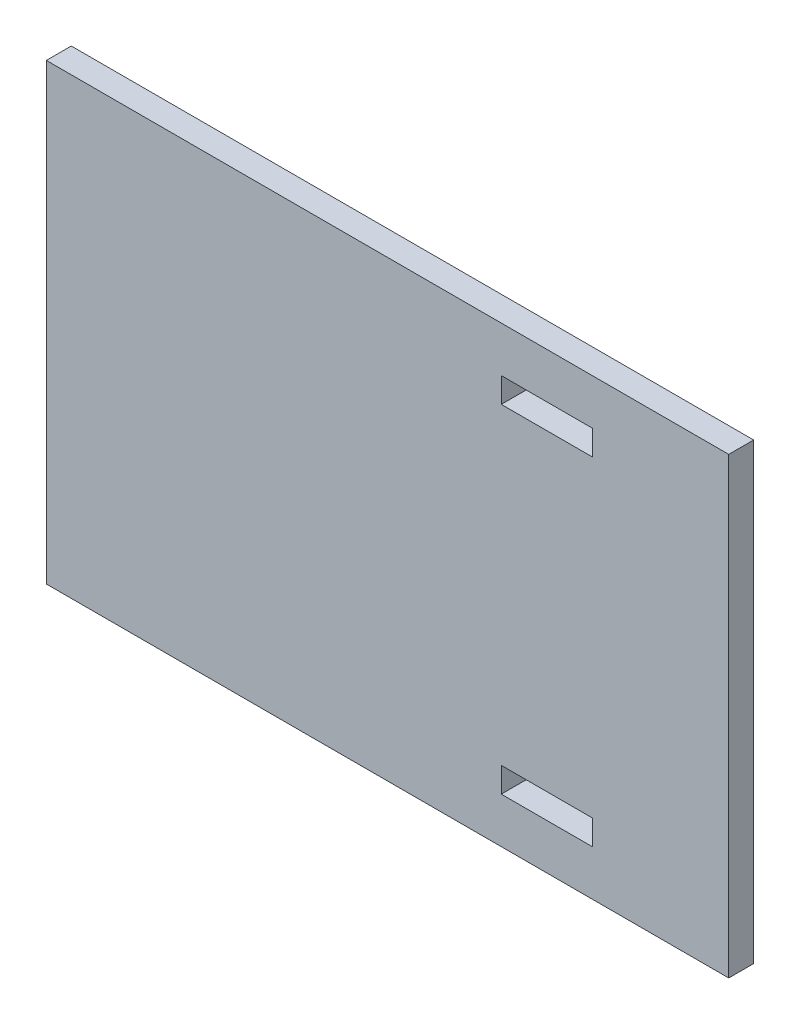
ISO-10303-21;
HEADER;
FILE_DESCRIPTION(('STEP AP214'),'2;1');
FILE_NAME('part.step','',(''),(''),'','','');
FILE_SCHEMA(('AUTOMOTIVE_DESIGN { 1 0 10303 214 1 1 1 1 }'));
ENDSEC;
DATA;
#1=APPLICATION_CONTEXT('core data for automotive mechanical design processes');
#2=APPLICATION_PROTOCOL_DEFINITION('international standard','automotive_design',2000,#1);
#3=PRODUCT_CONTEXT('',#1,'mechanical');
#4=PRODUCT('Part','Part','',(#3));
#5=PRODUCT_RELATED_PRODUCT_CATEGORY('part','',(#4));
#6=PRODUCT_DEFINITION_FORMATION('','',#4);
#7=PRODUCT_DEFINITION_CONTEXT('part definition',#1,'design');
#8=PRODUCT_DEFINITION('design','',#6,#7);
#9=PRODUCT_DEFINITION_SHAPE('','',#8);
#10=(LENGTH_UNIT() NAMED_UNIT(*) SI_UNIT(.MILLI.,.METRE.));
#11=(NAMED_UNIT(*) PLANE_ANGLE_UNIT() SI_UNIT($,.RADIAN.));
#12=(NAMED_UNIT(*) SI_UNIT($,.STERADIAN.) SOLID_ANGLE_UNIT());
#13=UNCERTAINTY_MEASURE_WITH_UNIT(LENGTH_MEASURE(1.E-05),#10,'distance_accuracy_value','');
#14=(GEOMETRIC_REPRESENTATION_CONTEXT(3) GLOBAL_UNCERTAINTY_ASSIGNED_CONTEXT((#13)) GLOBAL_UNIT_ASSIGNED_CONTEXT((#10,
#11,#12)) REPRESENTATION_CONTEXT('',''));
#15=CARTESIAN_POINT('',(0.,0.,0.));
#16=DIRECTION('',(0.,0.,1.));
#17=DIRECTION('',(1.,0.,0.));
#18=AXIS2_PLACEMENT_3D('',#15,#16,#17);
#19=CARTESIAN_POINT('',(0.,0.,2.74));
#20=DIRECTION('',(0.,0.,-1.));
#21=DIRECTION('',(-1.,0.,0.));
#22=AXIS2_PLACEMENT_3D('',#19,#20,#21);
#23=PLANE('',#22);
#24=DIRECTION('',(-1.,0.,0.));
#25=VECTOR('',#24,1.);
#26=CARTESIAN_POINT('',(-25.,44.84,2.74));
#27=LINE('',#26,#25);
#28=CARTESIAN_POINT('',(-15.,44.84,2.74));
#29=VERTEX_POINT('',#28);
#30=CARTESIAN_POINT('',(-25.,44.84,2.74));
#31=VERTEX_POINT('',#30);
#32=EDGE_CURVE('E163',#29,#31,#27,.T.);
#33=ORIENTED_EDGE('',*,*,#32,.F.);
#34=DIRECTION('',(0.,1.,0.));
#35=VECTOR('',#34,1.);
#36=CARTESIAN_POINT('',(-15.,42.1,2.74));
#37=LINE('',#36,#35);
#38=CARTESIAN_POINT('',(-15.,42.1,2.74));
#39=VERTEX_POINT('',#38);
#40=EDGE_CURVE('E175',#39,#29,#37,.T.);
#41=ORIENTED_EDGE('',*,*,#40,.F.);
#42=DIRECTION('',(1.,0.,0.));
#43=VECTOR('',#42,1.);
#44=CARTESIAN_POINT('',(-25.,42.1,2.74));
#45=LINE('',#44,#43);
#46=CARTESIAN_POINT('',(-25.,42.1,2.74));
#47=VERTEX_POINT('',#46);
#48=EDGE_CURVE('E166',#47,#39,#45,.T.);
#49=ORIENTED_EDGE('',*,*,#48,.F.);
#50=DIRECTION('',(0.,-1.,0.));
#51=VECTOR('',#50,1.);
#52=CARTESIAN_POINT('',(-25.,42.1,2.74));
#53=LINE('',#52,#51);
#54=EDGE_CURVE('E167',#31,#47,#53,.T.);
#55=ORIENTED_EDGE('',*,*,#54,.F.);
#56=EDGE_LOOP('',(#33,#41,#49,#55));
#57=FACE_BOUND('',#56,.T.);
#58=DIRECTION('',(1.,0.,0.));
#59=VECTOR('',#58,1.);
#60=CARTESIAN_POINT('',(0.,0.,2.74));
#61=LINE('',#60,#59);
#62=CARTESIAN_POINT('',(-75.,0.,2.74));
#63=VERTEX_POINT('',#62);
#64=CARTESIAN_POINT('',(0.,0.,2.74));
#65=VERTEX_POINT('',#64);
#66=EDGE_CURVE('E194',#63,#65,#61,.T.);
#67=ORIENTED_EDGE('',*,*,#66,.T.);
#68=DIRECTION('',(0.,1.,0.));
#69=VECTOR('',#68,1.);
#70=CARTESIAN_POINT('',(0.,0.,2.74));
#71=LINE('',#70,#69);
#72=CARTESIAN_POINT('',(0.,49.84,2.74));
#73=VERTEX_POINT('',#72);
#74=EDGE_CURVE('E196',#65,#73,#71,.T.);
#75=ORIENTED_EDGE('',*,*,#74,.T.);
#76=DIRECTION('',(-1.,0.,0.));
#77=VECTOR('',#76,1.);
#78=CARTESIAN_POINT('',(0.,49.84,2.74));
#79=LINE('',#78,#77);
#80=CARTESIAN_POINT('',(-75.,49.84,2.74));
#81=VERTEX_POINT('',#80);
#82=EDGE_CURVE('E203',#73,#81,#79,.T.);
#83=ORIENTED_EDGE('',*,*,#82,.T.);
#84=DIRECTION('',(0.,-1.,0.));
#85=VECTOR('',#84,1.);
#86=CARTESIAN_POINT('',(-75.,0.,2.74));
#87=LINE('',#86,#85);
#88=EDGE_CURVE('E201',#81,#63,#87,.T.);
#89=ORIENTED_EDGE('',*,*,#88,.T.);
#90=EDGE_LOOP('',(#67,#75,#83,#89));
#91=FACE_BOUND('',#90,.T.);
#92=DIRECTION('',(-1.,0.,0.));
#93=VECTOR('',#92,1.);
#94=CARTESIAN_POINT('',(-25.,7.74,2.74));
#95=LINE('',#94,#93);
#96=CARTESIAN_POINT('',(-15.,7.74,2.74));
#97=VERTEX_POINT('',#96);
#98=CARTESIAN_POINT('',(-25.,7.74,2.74));
#99=VERTEX_POINT('',#98);
#100=EDGE_CURVE('E126',#97,#99,#95,.T.);
#101=ORIENTED_EDGE('',*,*,#100,.F.);
#102=DIRECTION('',(0.,1.,0.));
#103=VECTOR('',#102,1.);
#104=CARTESIAN_POINT('',(-15.,5.,2.74));
#105=LINE('',#104,#103);
#106=CARTESIAN_POINT('',(-15.,5.,2.74));
#107=VERTEX_POINT('',#106);
#108=EDGE_CURVE('E147',#107,#97,#105,.T.);
#109=ORIENTED_EDGE('',*,*,#108,.F.);
#110=DIRECTION('',(1.,0.,0.));
#111=VECTOR('',#110,1.);
#112=CARTESIAN_POINT('',(-25.,5.,2.74));
#113=LINE('',#112,#111);
#114=CARTESIAN_POINT('',(-25.,5.,2.74));
#115=VERTEX_POINT('',#114);
#116=EDGE_CURVE('E146',#115,#107,#113,.T.);
#117=ORIENTED_EDGE('',*,*,#116,.F.);
#118=DIRECTION('',(0.,-1.,0.));
#119=VECTOR('',#118,1.);
#120=CARTESIAN_POINT('',(-25.,5.,2.74));
#121=LINE('',#120,#119);
#122=EDGE_CURVE('E138',#99,#115,#121,.T.);
#123=ORIENTED_EDGE('',*,*,#122,.F.);
#124=EDGE_LOOP('',(#101,#109,#117,#123));
#125=FACE_BOUND('',#124,.T.);
#126=ADVANCED_FACE('F39',(#57,#91,#125),#23,.F.);
#127=CARTESIAN_POINT('',(0.,0.,0.));
#128=DIRECTION('',(0.,0.,-1.));
#129=DIRECTION('',(-1.,0.,0.));
#130=AXIS2_PLACEMENT_3D('',#127,#128,#129);
#131=PLANE('',#130);
#132=DIRECTION('',(1.,0.,0.));
#133=VECTOR('',#132,1.);
#134=CARTESIAN_POINT('',(0.,0.,0.));
#135=LINE('',#134,#133);
#136=CARTESIAN_POINT('',(-75.,0.,0.));
#137=VERTEX_POINT('',#136);
#138=CARTESIAN_POINT('',(0.,0.,0.));
#139=VERTEX_POINT('',#138);
#140=EDGE_CURVE('E192',#137,#139,#135,.T.);
#141=ORIENTED_EDGE('',*,*,#140,.F.);
#142=DIRECTION('',(0.,-1.,0.));
#143=VECTOR('',#142,1.);
#144=CARTESIAN_POINT('',(-75.,0.,0.));
#145=LINE('',#144,#143);
#146=CARTESIAN_POINT('',(-75.,49.84,0.));
#147=VERTEX_POINT('',#146);
#148=EDGE_CURVE('E200',#147,#137,#145,.T.);
#149=ORIENTED_EDGE('',*,*,#148,.F.);
#150=DIRECTION('',(-1.,0.,0.));
#151=VECTOR('',#150,1.);
#152=CARTESIAN_POINT('',(0.,49.84,0.));
#153=LINE('',#152,#151);
#154=CARTESIAN_POINT('',(0.,49.84,0.));
#155=VERTEX_POINT('',#154);
#156=EDGE_CURVE('E209',#155,#147,#153,.T.);
#157=ORIENTED_EDGE('',*,*,#156,.F.);
#158=DIRECTION('',(0.,1.,0.));
#159=VECTOR('',#158,1.);
#160=CARTESIAN_POINT('',(0.,0.,0.));
#161=LINE('',#160,#159);
#162=EDGE_CURVE('E208',#139,#155,#161,.T.);
#163=ORIENTED_EDGE('',*,*,#162,.F.);
#164=EDGE_LOOP('',(#141,#149,#157,#163));
#165=FACE_BOUND('',#164,.T.);
#166=DIRECTION('',(0.,1.,0.));
#167=VECTOR('',#166,1.);
#168=CARTESIAN_POINT('',(-15.,42.1,0.));
#169=LINE('',#168,#167);
#170=CARTESIAN_POINT('',(-15.,42.1,0.));
#171=VERTEX_POINT('',#170);
#172=CARTESIAN_POINT('',(-15.,44.84,0.));
#173=VERTEX_POINT('',#172);
#174=EDGE_CURVE('E170',#171,#173,#169,.T.);
#175=ORIENTED_EDGE('',*,*,#174,.T.);
#176=DIRECTION('',(-1.,0.,0.));
#177=VECTOR('',#176,1.);
#178=CARTESIAN_POINT('',(-25.,44.84,0.));
#179=LINE('',#178,#177);
#180=CARTESIAN_POINT('',(-25.,44.84,0.));
#181=VERTEX_POINT('',#180);
#182=EDGE_CURVE('E145',#173,#181,#179,.T.);
#183=ORIENTED_EDGE('',*,*,#182,.T.);
#184=DIRECTION('',(0.,-1.,0.));
#185=VECTOR('',#184,1.);
#186=CARTESIAN_POINT('',(-25.,42.1,0.));
#187=LINE('',#186,#185);
#188=CARTESIAN_POINT('',(-25.,42.1,0.));
#189=VERTEX_POINT('',#188);
#190=EDGE_CURVE('E180',#181,#189,#187,.T.);
#191=ORIENTED_EDGE('',*,*,#190,.T.);
#192=DIRECTION('',(1.,0.,0.));
#193=VECTOR('',#192,1.);
#194=CARTESIAN_POINT('',(-25.,42.1,0.));
#195=LINE('',#194,#193);
#196=EDGE_CURVE('E176',#189,#171,#195,.T.);
#197=ORIENTED_EDGE('',*,*,#196,.T.);
#198=EDGE_LOOP('',(#175,#183,#191,#197));
#199=FACE_BOUND('',#198,.T.);
#200=DIRECTION('',(0.,1.,0.));
#201=VECTOR('',#200,1.);
#202=CARTESIAN_POINT('',(-15.,5.,0.));
#203=LINE('',#202,#201);
#204=CARTESIAN_POINT('',(-15.,5.,0.));
#205=VERTEX_POINT('',#204);
#206=CARTESIAN_POINT('',(-15.,7.74,0.));
#207=VERTEX_POINT('',#206);
#208=EDGE_CURVE('E140',#205,#207,#203,.T.);
#209=ORIENTED_EDGE('',*,*,#208,.T.);
#210=DIRECTION('',(-1.,0.,0.));
#211=VECTOR('',#210,1.);
#212=CARTESIAN_POINT('',(-25.,7.74,0.));
#213=LINE('',#212,#211);
#214=CARTESIAN_POINT('',(-25.,7.74,0.));
#215=VERTEX_POINT('',#214);
#216=EDGE_CURVE('E65',#207,#215,#213,.T.);
#217=ORIENTED_EDGE('',*,*,#216,.T.);
#218=DIRECTION('',(0.,-1.,0.));
#219=VECTOR('',#218,1.);
#220=CARTESIAN_POINT('',(-25.,5.,0.));
#221=LINE('',#220,#219);
#222=CARTESIAN_POINT('',(-25.,5.,0.));
#223=VERTEX_POINT('',#222);
#224=EDGE_CURVE('E141',#215,#223,#221,.T.);
#225=ORIENTED_EDGE('',*,*,#224,.T.);
#226=DIRECTION('',(1.,0.,0.));
#227=VECTOR('',#226,1.);
#228=CARTESIAN_POINT('',(-25.,5.,0.));
#229=LINE('',#228,#227);
#230=EDGE_CURVE('E156',#223,#205,#229,.T.);
#231=ORIENTED_EDGE('',*,*,#230,.T.);
#232=EDGE_LOOP('',(#209,#217,#225,#231));
#233=FACE_BOUND('',#232,.T.);
#234=ADVANCED_FACE('F227',(#165,#199,#233),#131,.T.);
#235=CARTESIAN_POINT('',(0.,0.,2.74));
#236=DIRECTION('',(0.,1.,0.));
#237=DIRECTION('',(0.,0.,1.));
#238=AXIS2_PLACEMENT_3D('',#235,#236,#237);
#239=PLANE('',#238);
#240=ORIENTED_EDGE('',*,*,#140,.T.);
#241=DIRECTION('',(0.,0.,-1.));
#242=VECTOR('',#241,1.);
#243=CARTESIAN_POINT('',(0.,0.,2.74));
#244=LINE('',#243,#242);
#245=EDGE_CURVE('E11',#65,#139,#244,.T.);
#246=ORIENTED_EDGE('',*,*,#245,.F.);
#247=ORIENTED_EDGE('',*,*,#66,.F.);
#248=DIRECTION('',(0.,0.,-1.));
#249=VECTOR('',#248,1.);
#250=CARTESIAN_POINT('',(-75.,0.,2.74));
#251=LINE('',#250,#249);
#252=EDGE_CURVE('E202',#63,#137,#251,.T.);
#253=ORIENTED_EDGE('',*,*,#252,.T.);
#254=EDGE_LOOP('',(#240,#246,#247,#253));
#255=FACE_BOUND('',#254,.T.);
#256=ADVANCED_FACE('F41',(#255),#239,.F.);
#257=CARTESIAN_POINT('',(0.,0.,2.74));
#258=DIRECTION('',(-1.,0.,0.));
#259=DIRECTION('',(0.,0.,1.));
#260=AXIS2_PLACEMENT_3D('',#257,#258,#259);
#261=PLANE('',#260);
#262=ORIENTED_EDGE('',*,*,#162,.T.);
#263=DIRECTION('',(0.,0.,-1.));
#264=VECTOR('',#263,1.);
#265=CARTESIAN_POINT('',(0.,49.84,2.74));
#266=LINE('',#265,#264);
#267=EDGE_CURVE('E50',#73,#155,#266,.T.);
#268=ORIENTED_EDGE('',*,*,#267,.F.);
#269=ORIENTED_EDGE('',*,*,#74,.F.);
#270=ORIENTED_EDGE('',*,*,#245,.T.);
#271=EDGE_LOOP('',(#262,#268,#269,#270));
#272=FACE_BOUND('',#271,.T.);
#273=ADVANCED_FACE('F236',(#272),#261,.F.);
#274=CARTESIAN_POINT('',(0.,49.84,2.74));
#275=DIRECTION('',(0.,-1.,0.));
#276=DIRECTION('',(0.,0.,-1.));
#277=AXIS2_PLACEMENT_3D('',#274,#275,#276);
#278=PLANE('',#277);
#279=ORIENTED_EDGE('',*,*,#156,.T.);
#280=DIRECTION('',(0.,0.,-1.));
#281=VECTOR('',#280,1.);
#282=CARTESIAN_POINT('',(-75.,49.84,2.74));
#283=LINE('',#282,#281);
#284=EDGE_CURVE('E214',#81,#147,#283,.T.);
#285=ORIENTED_EDGE('',*,*,#284,.F.);
#286=ORIENTED_EDGE('',*,*,#82,.F.);
#287=ORIENTED_EDGE('',*,*,#267,.T.);
#288=EDGE_LOOP('',(#279,#285,#286,#287));
#289=FACE_BOUND('',#288,.T.);
#290=ADVANCED_FACE('F225',(#289),#278,.F.);
#291=CARTESIAN_POINT('',(-75.,0.,2.74));
#292=DIRECTION('',(1.,0.,0.));
#293=DIRECTION('',(0.,0.,-1.));
#294=AXIS2_PLACEMENT_3D('',#291,#292,#293);
#295=PLANE('',#294);
#296=ORIENTED_EDGE('',*,*,#148,.T.);
#297=ORIENTED_EDGE('',*,*,#252,.F.);
#298=ORIENTED_EDGE('',*,*,#88,.F.);
#299=ORIENTED_EDGE('',*,*,#284,.T.);
#300=EDGE_LOOP('',(#296,#297,#298,#299));
#301=FACE_BOUND('',#300,.T.);
#302=ADVANCED_FACE('F235',(#301),#295,.F.);
#303=CARTESIAN_POINT('',(-25.,44.84,2.74));
#304=DIRECTION('',(0.,-1.,0.));
#305=DIRECTION('',(0.,0.,-1.));
#306=AXIS2_PLACEMENT_3D('',#303,#304,#305);
#307=PLANE('',#306);
#308=ORIENTED_EDGE('',*,*,#182,.F.);
#309=DIRECTION('',(0.,0.,-1.));
#310=VECTOR('',#309,1.);
#311=CARTESIAN_POINT('',(-15.,44.84,2.74));
#312=LINE('',#311,#310);
#313=EDGE_CURVE('E173',#29,#173,#312,.T.);
#314=ORIENTED_EDGE('',*,*,#313,.F.);
#315=ORIENTED_EDGE('',*,*,#32,.T.);
#316=DIRECTION('',(0.,0.,-1.));
#317=VECTOR('',#316,1.);
#318=CARTESIAN_POINT('',(-25.,44.84,2.74));
#319=LINE('',#318,#317);
#320=EDGE_CURVE('E193',#31,#181,#319,.T.);
#321=ORIENTED_EDGE('',*,*,#320,.T.);
#322=EDGE_LOOP('',(#308,#314,#315,#321));
#323=FACE_BOUND('',#322,.T.);
#324=ADVANCED_FACE('F255',(#323),#307,.T.);
#325=CARTESIAN_POINT('',(-25.,42.1,2.74));
#326=DIRECTION('',(1.,0.,0.));
#327=DIRECTION('',(0.,0.,-1.));
#328=AXIS2_PLACEMENT_3D('',#325,#326,#327);
#329=PLANE('',#328);
#330=ORIENTED_EDGE('',*,*,#190,.F.);
#331=ORIENTED_EDGE('',*,*,#320,.F.);
#332=ORIENTED_EDGE('',*,*,#54,.T.);
#333=DIRECTION('',(0.,0.,-1.));
#334=VECTOR('',#333,1.);
#335=CARTESIAN_POINT('',(-25.,42.1,2.74));
#336=LINE('',#335,#334);
#337=EDGE_CURVE('E188',#47,#189,#336,.T.);
#338=ORIENTED_EDGE('',*,*,#337,.T.);
#339=EDGE_LOOP('',(#330,#331,#332,#338));
#340=FACE_BOUND('',#339,.T.);
#341=ADVANCED_FACE('F261',(#340),#329,.T.);
#342=CARTESIAN_POINT('',(-25.,42.1,2.74));
#343=DIRECTION('',(0.,1.,0.));
#344=DIRECTION('',(0.,0.,1.));
#345=AXIS2_PLACEMENT_3D('',#342,#343,#344);
#346=PLANE('',#345);
#347=ORIENTED_EDGE('',*,*,#196,.F.);
#348=ORIENTED_EDGE('',*,*,#337,.F.);
#349=ORIENTED_EDGE('',*,*,#48,.T.);
#350=DIRECTION('',(0.,0.,-1.));
#351=VECTOR('',#350,1.);
#352=CARTESIAN_POINT('',(-15.,42.1,2.74));
#353=LINE('',#352,#351);
#354=EDGE_CURVE('E190',#39,#171,#353,.T.);
#355=ORIENTED_EDGE('',*,*,#354,.T.);
#356=EDGE_LOOP('',(#347,#348,#349,#355));
#357=FACE_BOUND('',#356,.T.);
#358=ADVANCED_FACE('F266',(#357),#346,.T.);
#359=CARTESIAN_POINT('',(-15.,42.1,2.74));
#360=DIRECTION('',(-1.,0.,0.));
#361=DIRECTION('',(0.,0.,1.));
#362=AXIS2_PLACEMENT_3D('',#359,#360,#361);
#363=PLANE('',#362);
#364=ORIENTED_EDGE('',*,*,#174,.F.);
#365=ORIENTED_EDGE('',*,*,#354,.F.);
#366=ORIENTED_EDGE('',*,*,#40,.T.);
#367=ORIENTED_EDGE('',*,*,#313,.T.);
#368=EDGE_LOOP('',(#364,#365,#366,#367));
#369=FACE_BOUND('',#368,.T.);
#370=ADVANCED_FACE('F275',(#369),#363,.T.);
#371=CARTESIAN_POINT('',(-25.,7.74,2.74));
#372=DIRECTION('',(0.,-1.,0.));
#373=DIRECTION('',(1.,0.,0.));
#374=AXIS2_PLACEMENT_3D('',#371,#372,#373);
#375=PLANE('',#374);
#376=ORIENTED_EDGE('',*,*,#216,.F.);
#377=DIRECTION('',(0.,0.,-1.));
#378=VECTOR('',#377,1.);
#379=CARTESIAN_POINT('',(-15.,7.74,2.74));
#380=LINE('',#379,#378);
#381=EDGE_CURVE('E135',#97,#207,#380,.T.);
#382=ORIENTED_EDGE('',*,*,#381,.F.);
#383=ORIENTED_EDGE('',*,*,#100,.T.);
#384=DIRECTION('',(0.,0.,-1.));
#385=VECTOR('',#384,1.);
#386=CARTESIAN_POINT('',(-25.,7.74,2.74));
#387=LINE('',#386,#385);
#388=EDGE_CURVE('E131',#99,#215,#387,.T.);
#389=ORIENTED_EDGE('',*,*,#388,.T.);
#390=EDGE_LOOP('',(#376,#382,#383,#389));
#391=FACE_BOUND('',#390,.T.);
#392=ADVANCED_FACE('F128',(#391),#375,.T.);
#393=CARTESIAN_POINT('',(-25.,5.,2.74));
#394=DIRECTION('',(1.,0.,0.));
#395=DIRECTION('',(0.,0.,-1.));
#396=AXIS2_PLACEMENT_3D('',#393,#394,#395);
#397=PLANE('',#396);
#398=ORIENTED_EDGE('',*,*,#224,.F.);
#399=ORIENTED_EDGE('',*,*,#388,.F.);
#400=ORIENTED_EDGE('',*,*,#122,.T.);
#401=DIRECTION('',(0.,0.,-1.));
#402=VECTOR('',#401,1.);
#403=CARTESIAN_POINT('',(-25.,5.,2.74));
#404=LINE('',#403,#402);
#405=EDGE_CURVE('E144',#115,#223,#404,.T.);
#406=ORIENTED_EDGE('',*,*,#405,.T.);
#407=EDGE_LOOP('',(#398,#399,#400,#406));
#408=FACE_BOUND('',#407,.T.);
#409=ADVANCED_FACE('F139',(#408),#397,.T.);
#410=CARTESIAN_POINT('',(-25.,5.,2.74));
#411=DIRECTION('',(0.,1.,0.));
#412=DIRECTION('',(-1.,0.,0.));
#413=AXIS2_PLACEMENT_3D('',#410,#411,#412);
#414=PLANE('',#413);
#415=ORIENTED_EDGE('',*,*,#230,.F.);
#416=ORIENTED_EDGE('',*,*,#405,.F.);
#417=ORIENTED_EDGE('',*,*,#116,.T.);
#418=DIRECTION('',(0.,0.,-1.));
#419=VECTOR('',#418,1.);
#420=CARTESIAN_POINT('',(-15.,5.,2.74));
#421=LINE('',#420,#419);
#422=EDGE_CURVE('E53',#107,#205,#421,.T.);
#423=ORIENTED_EDGE('',*,*,#422,.T.);
#424=EDGE_LOOP('',(#415,#416,#417,#423));
#425=FACE_BOUND('',#424,.T.);
#426=ADVANCED_FACE('F292',(#425),#414,.T.);
#427=CARTESIAN_POINT('',(-15.,5.,2.74));
#428=DIRECTION('',(-1.,0.,0.));
#429=DIRECTION('',(0.,0.,1.));
#430=AXIS2_PLACEMENT_3D('',#427,#428,#429);
#431=PLANE('',#430);
#432=ORIENTED_EDGE('',*,*,#208,.F.);
#433=ORIENTED_EDGE('',*,*,#422,.F.);
#434=ORIENTED_EDGE('',*,*,#108,.T.);
#435=ORIENTED_EDGE('',*,*,#381,.T.);
#436=EDGE_LOOP('',(#432,#433,#434,#435));
#437=FACE_BOUND('',#436,.T.);
#438=ADVANCED_FACE('F294',(#437),#431,.T.);
#439=CLOSED_SHELL('',(#126,#234,#256,#273,#290,#302,#324,#341,#358,#370,#392,#409,#426,#438));
#440=MANIFOLD_SOLID_BREP('B2',#439);
#441=ADVANCED_BREP_SHAPE_REPRESENTATION('',(#18,#440),#14);
#442=SHAPE_DEFINITION_REPRESENTATION(#9,#441);
ENDSEC;
END-ISO-10303-21;
